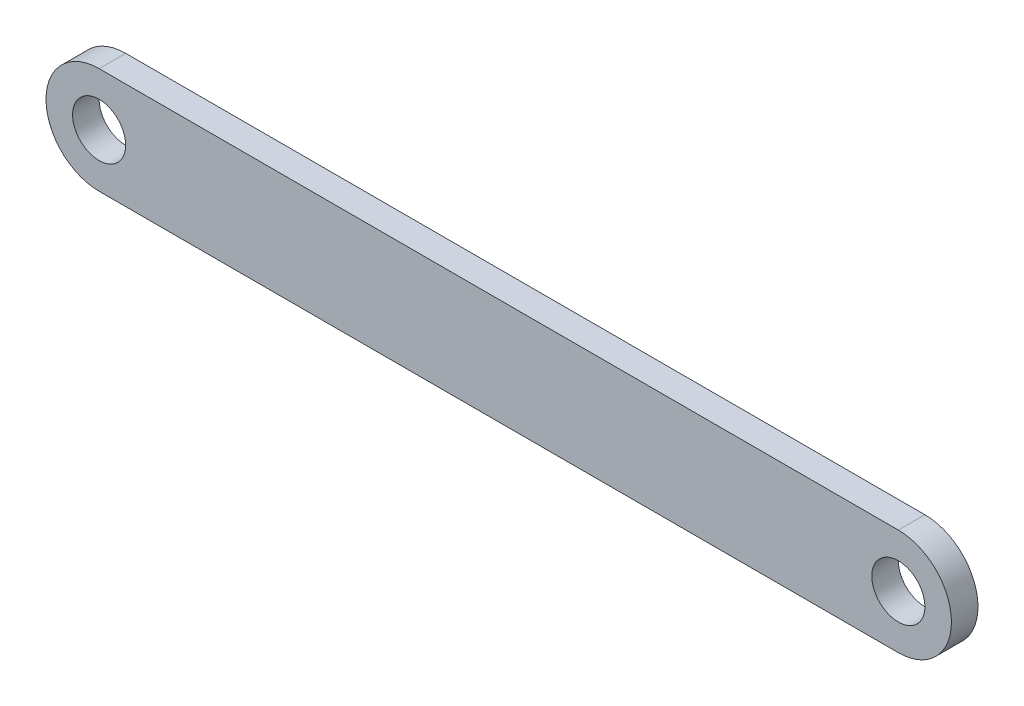
ISO-10303-21;
HEADER;
FILE_DESCRIPTION(('STEP AP214'),'2;1');
FILE_NAME('part.step','',(''),(''),'','','');
FILE_SCHEMA(('AUTOMOTIVE_DESIGN { 1 0 10303 214 1 1 1 1 }'));
ENDSEC;
DATA;
#1=APPLICATION_CONTEXT('core data for automotive mechanical design processes');
#2=APPLICATION_PROTOCOL_DEFINITION('international standard','automotive_design',2000,#1);
#3=PRODUCT_CONTEXT('',#1,'mechanical');
#4=PRODUCT('Part','Part','',(#3));
#5=PRODUCT_RELATED_PRODUCT_CATEGORY('part','',(#4));
#6=PRODUCT_DEFINITION_FORMATION('','',#4);
#7=PRODUCT_DEFINITION_CONTEXT('part definition',#1,'design');
#8=PRODUCT_DEFINITION('design','',#6,#7);
#9=PRODUCT_DEFINITION_SHAPE('','',#8);
#10=(LENGTH_UNIT() NAMED_UNIT(*) SI_UNIT(.MILLI.,.METRE.));
#11=(NAMED_UNIT(*) PLANE_ANGLE_UNIT() SI_UNIT($,.RADIAN.));
#12=(NAMED_UNIT(*) SI_UNIT($,.STERADIAN.) SOLID_ANGLE_UNIT());
#13=UNCERTAINTY_MEASURE_WITH_UNIT(LENGTH_MEASURE(1.E-05),#10,'distance_accuracy_value','');
#14=(GEOMETRIC_REPRESENTATION_CONTEXT(3) GLOBAL_UNCERTAINTY_ASSIGNED_CONTEXT((#13)) GLOBAL_UNIT_ASSIGNED_CONTEXT((#10,
#11,#12)) REPRESENTATION_CONTEXT('',''));
#15=CARTESIAN_POINT('',(0.,0.,0.));
#16=DIRECTION('',(0.,0.,1.));
#17=DIRECTION('',(1.,0.,0.));
#18=AXIS2_PLACEMENT_3D('',#15,#16,#17);
#19=CARTESIAN_POINT('',(0.,-25.4000000000001,6.35));
#20=DIRECTION('',(0.,1.,0.));
#21=DIRECTION('',(-1.,0.,0.));
#22=AXIS2_PLACEMENT_3D('',#19,#20,#21);
#23=PLANE('',#22);
#24=DIRECTION('',(1.,0.,0.));
#25=VECTOR('',#24,1.);
#26=CARTESIAN_POINT('',(0.,-25.4000000000001,-6.35));
#27=LINE('',#26,#25);
#28=CARTESIAN_POINT('',(-191.135,-25.4000000000001,-6.35));
#29=VERTEX_POINT('',#28);
#30=CARTESIAN_POINT('',(191.135,-25.4000000000001,-6.35));
#31=VERTEX_POINT('',#30);
#32=EDGE_CURVE('E107',#29,#31,#27,.T.);
#33=ORIENTED_EDGE('',*,*,#32,.T.);
#34=DIRECTION('',(0.,0.,-1.));
#35=VECTOR('',#34,1.);
#36=CARTESIAN_POINT('',(191.135,-25.4000000000001,6.35));
#37=LINE('',#36,#35);
#38=CARTESIAN_POINT('',(191.135,-25.4000000000001,6.35));
#39=VERTEX_POINT('',#38);
#40=EDGE_CURVE('E11',#39,#31,#37,.T.);
#41=ORIENTED_EDGE('',*,*,#40,.F.);
#42=DIRECTION('',(1.,0.,0.));
#43=VECTOR('',#42,1.);
#44=CARTESIAN_POINT('',(0.,-25.4000000000001,6.35));
#45=LINE('',#44,#43);
#46=CARTESIAN_POINT('',(-191.135,-25.4000000000001,6.35));
#47=VERTEX_POINT('',#46);
#48=EDGE_CURVE('E86',#47,#39,#45,.T.);
#49=ORIENTED_EDGE('',*,*,#48,.F.);
#50=DIRECTION('',(0.,0.,-1.));
#51=VECTOR('',#50,1.);
#52=CARTESIAN_POINT('',(-191.135,-25.4000000000001,6.35));
#53=LINE('',#52,#51);
#54=EDGE_CURVE('E103',#47,#29,#53,.T.);
#55=ORIENTED_EDGE('',*,*,#54,.T.);
#56=EDGE_LOOP('',(#33,#41,#49,#55));
#57=FACE_BOUND('',#56,.T.);
#58=ADVANCED_FACE('F37',(#57),#23,.F.);
#59=CARTESIAN_POINT('',(191.135,0.,6.35));
#60=DIRECTION('',(0.,0.,-1.));
#61=DIRECTION('',(-1.,0.,0.));
#62=AXIS2_PLACEMENT_3D('',#59,#60,#61);
#63=CYLINDRICAL_SURFACE('',#62,25.4);
#64=CARTESIAN_POINT('',(191.135,0.,-6.35));
#65=DIRECTION('',(0.,0.,1.));
#66=DIRECTION('',(1.,0.,0.));
#67=AXIS2_PLACEMENT_3D('',#64,#65,#66);
#68=CIRCLE('',#67,25.4);
#69=CARTESIAN_POINT('',(191.135,25.3999999999999,-6.35));
#70=VERTEX_POINT('',#69);
#71=EDGE_CURVE('E91',#31,#70,#68,.T.);
#72=ORIENTED_EDGE('',*,*,#71,.T.);
#73=DIRECTION('',(0.,0.,-1.));
#74=VECTOR('',#73,1.);
#75=CARTESIAN_POINT('',(191.135,25.3999999999999,6.35));
#76=LINE('',#75,#74);
#77=CARTESIAN_POINT('',(191.135,25.3999999999999,6.35));
#78=VERTEX_POINT('',#77);
#79=EDGE_CURVE('E46',#78,#70,#76,.T.);
#80=ORIENTED_EDGE('',*,*,#79,.F.);
#81=CARTESIAN_POINT('',(191.135,0.,6.35));
#82=DIRECTION('',(0.,0.,1.));
#83=DIRECTION('',(1.,0.,0.));
#84=AXIS2_PLACEMENT_3D('',#81,#82,#83);
#85=CIRCLE('',#84,25.4);
#86=EDGE_CURVE('E80',#39,#78,#85,.T.);
#87=ORIENTED_EDGE('',*,*,#86,.F.);
#88=ORIENTED_EDGE('',*,*,#40,.T.);
#89=EDGE_LOOP('',(#72,#80,#87,#88));
#90=FACE_BOUND('',#89,.T.);
#91=ADVANCED_FACE('F90',(#90),#63,.T.);
#92=CARTESIAN_POINT('',(0.,25.3999999999999,6.35));
#93=DIRECTION('',(0.,1.,0.));
#94=DIRECTION('',(-1.,0.,0.));
#95=AXIS2_PLACEMENT_3D('',#92,#93,#94);
#96=PLANE('',#95);
#97=DIRECTION('',(1.,0.,0.));
#98=VECTOR('',#97,1.);
#99=CARTESIAN_POINT('',(0.,25.3999999999999,-6.35));
#100=LINE('',#99,#98);
#101=CARTESIAN_POINT('',(-191.135,25.3999999999999,-6.35));
#102=VERTEX_POINT('',#101);
#103=EDGE_CURVE('E111',#102,#70,#100,.T.);
#104=ORIENTED_EDGE('',*,*,#103,.F.);
#105=DIRECTION('',(0.,0.,-1.));
#106=VECTOR('',#105,1.);
#107=CARTESIAN_POINT('',(-191.135,25.3999999999999,6.35));
#108=LINE('',#107,#106);
#109=CARTESIAN_POINT('',(-191.135,25.3999999999999,6.35));
#110=VERTEX_POINT('',#109);
#111=EDGE_CURVE('E70',#110,#102,#108,.T.);
#112=ORIENTED_EDGE('',*,*,#111,.F.);
#113=DIRECTION('',(1.,0.,0.));
#114=VECTOR('',#113,1.);
#115=CARTESIAN_POINT('',(0.,25.3999999999999,6.35));
#116=LINE('',#115,#114);
#117=EDGE_CURVE('E84',#110,#78,#116,.T.);
#118=ORIENTED_EDGE('',*,*,#117,.T.);
#119=ORIENTED_EDGE('',*,*,#79,.T.);
#120=EDGE_LOOP('',(#104,#112,#118,#119));
#121=FACE_BOUND('',#120,.T.);
#122=ADVANCED_FACE('F95',(#121),#96,.T.);
#123=CARTESIAN_POINT('',(-191.135,-1.13894724078982E-13,6.35));
#124=DIRECTION('',(0.,0.,-1.));
#125=DIRECTION('',(-1.,0.,0.));
#126=AXIS2_PLACEMENT_3D('',#123,#124,#125);
#127=CYLINDRICAL_SURFACE('',#126,25.4);
#128=CARTESIAN_POINT('',(-191.135,-1.13894724078982E-13,-6.35));
#129=DIRECTION('',(0.,0.,1.));
#130=DIRECTION('',(1.,0.,0.));
#131=AXIS2_PLACEMENT_3D('',#128,#129,#130);
#132=CIRCLE('',#131,25.4);
#133=EDGE_CURVE('E73',#102,#29,#132,.T.);
#134=ORIENTED_EDGE('',*,*,#133,.T.);
#135=ORIENTED_EDGE('',*,*,#54,.F.);
#136=CARTESIAN_POINT('',(-191.135,-1.13894724078982E-13,6.35));
#137=DIRECTION('',(0.,0.,1.));
#138=DIRECTION('',(1.,0.,0.));
#139=AXIS2_PLACEMENT_3D('',#136,#137,#138);
#140=CIRCLE('',#139,25.4);
#141=EDGE_CURVE('E54',#110,#47,#140,.T.);
#142=ORIENTED_EDGE('',*,*,#141,.F.);
#143=ORIENTED_EDGE('',*,*,#111,.T.);
#144=EDGE_LOOP('',(#134,#135,#142,#143));
#145=FACE_BOUND('',#144,.T.);
#146=ADVANCED_FACE('F139',(#145),#127,.T.);
#147=CARTESIAN_POINT('',(-191.135,-1.13894724078982E-13,6.35));
#148=DIRECTION('',(0.,0.,-1.));
#149=DIRECTION('',(-1.,0.,0.));
#150=AXIS2_PLACEMENT_3D('',#147,#148,#149);
#151=CYLINDRICAL_SURFACE('',#150,12.7);
#152=CARTESIAN_POINT('',(-191.135,-1.13894724078982E-13,6.35));
#153=DIRECTION('',(0.,0.,1.));
#154=DIRECTION('',(1.,0.,0.));
#155=AXIS2_PLACEMENT_3D('',#152,#153,#154);
#156=CIRCLE('',#155,12.7);
#157=CARTESIAN_POINT('',(-178.435,-1.13894724078982E-13,6.35));
#158=VERTEX_POINT('',#157);
#159=EDGE_CURVE('E117',#158,#158,#156,.T.);
#160=ORIENTED_EDGE('',*,*,#159,.T.);
#161=EDGE_LOOP('',(#160));
#162=FACE_BOUND('',#161,.T.);
#163=CARTESIAN_POINT('',(-191.135,-1.13894724078982E-13,-6.35));
#164=DIRECTION('',(0.,0.,1.));
#165=DIRECTION('',(1.,0.,0.));
#166=AXIS2_PLACEMENT_3D('',#163,#164,#165);
#167=CIRCLE('',#166,12.7);
#168=CARTESIAN_POINT('',(-178.435,-1.13894724078982E-13,-6.35));
#169=VERTEX_POINT('',#168);
#170=EDGE_CURVE('E104',#169,#169,#167,.T.);
#171=ORIENTED_EDGE('',*,*,#170,.F.);
#172=EDGE_LOOP('',(#171));
#173=FACE_BOUND('',#172,.T.);
#174=ADVANCED_FACE('F39',(#162,#173),#151,.F.);
#175=CARTESIAN_POINT('',(191.135,-1.13894724078982E-13,6.35));
#176=DIRECTION('',(0.,0.,-1.));
#177=DIRECTION('',(-1.,0.,0.));
#178=AXIS2_PLACEMENT_3D('',#175,#176,#177);
#179=CYLINDRICAL_SURFACE('',#178,12.7);
#180=CARTESIAN_POINT('',(191.135,-1.13894724078982E-13,6.35));
#181=DIRECTION('',(0.,0.,1.));
#182=DIRECTION('',(1.,0.,0.));
#183=AXIS2_PLACEMENT_3D('',#180,#181,#182);
#184=CIRCLE('',#183,12.7);
#185=CARTESIAN_POINT('',(203.835,-1.13894724078982E-13,6.35));
#186=VERTEX_POINT('',#185);
#187=EDGE_CURVE('E97',#186,#186,#184,.F.);
#188=ORIENTED_EDGE('',*,*,#187,.F.);
#189=EDGE_LOOP('',(#188));
#190=FACE_BOUND('',#189,.T.);
#191=CARTESIAN_POINT('',(191.135,-1.13894724078982E-13,-6.35));
#192=DIRECTION('',(0.,0.,1.));
#193=DIRECTION('',(1.,0.,0.));
#194=AXIS2_PLACEMENT_3D('',#191,#192,#193);
#195=CIRCLE('',#194,12.7);
#196=CARTESIAN_POINT('',(203.835,-1.13894724078982E-13,-6.35));
#197=VERTEX_POINT('',#196);
#198=EDGE_CURVE('E114',#197,#197,#195,.F.);
#199=ORIENTED_EDGE('',*,*,#198,.T.);
#200=EDGE_LOOP('',(#199));
#201=FACE_BOUND('',#200,.T.);
#202=ADVANCED_FACE('F129',(#190,#201),#179,.F.);
#203=CARTESIAN_POINT('',(0.,0.,6.35));
#204=DIRECTION('',(0.,0.,1.));
#205=DIRECTION('',(1.,0.,0.));
#206=AXIS2_PLACEMENT_3D('',#203,#204,#205);
#207=PLANE('',#206);
#208=ORIENTED_EDGE('',*,*,#159,.F.);
#209=EDGE_LOOP('',(#208));
#210=FACE_BOUND('',#209,.T.);
#211=ORIENTED_EDGE('',*,*,#48,.T.);
#212=ORIENTED_EDGE('',*,*,#86,.T.);
#213=ORIENTED_EDGE('',*,*,#117,.F.);
#214=ORIENTED_EDGE('',*,*,#141,.T.);
#215=EDGE_LOOP('',(#211,#212,#213,#214));
#216=FACE_BOUND('',#215,.T.);
#217=ORIENTED_EDGE('',*,*,#187,.T.);
#218=EDGE_LOOP('',(#217));
#219=FACE_BOUND('',#218,.T.);
#220=ADVANCED_FACE('F81',(#210,#216,#219),#207,.T.);
#221=CARTESIAN_POINT('',(0.,0.,-6.35));
#222=DIRECTION('',(0.,0.,1.));
#223=DIRECTION('',(1.,0.,0.));
#224=AXIS2_PLACEMENT_3D('',#221,#222,#223);
#225=PLANE('',#224);
#226=ORIENTED_EDGE('',*,*,#170,.T.);
#227=EDGE_LOOP('',(#226));
#228=FACE_BOUND('',#227,.T.);
#229=ORIENTED_EDGE('',*,*,#32,.F.);
#230=ORIENTED_EDGE('',*,*,#133,.F.);
#231=ORIENTED_EDGE('',*,*,#103,.T.);
#232=ORIENTED_EDGE('',*,*,#71,.F.);
#233=EDGE_LOOP('',(#229,#230,#231,#232));
#234=FACE_BOUND('',#233,.T.);
#235=ORIENTED_EDGE('',*,*,#198,.F.);
#236=EDGE_LOOP('',(#235));
#237=FACE_BOUND('',#236,.T.);
#238=ADVANCED_FACE('F122',(#228,#234,#237),#225,.F.);
#239=CLOSED_SHELL('',(#58,#91,#122,#146,#174,#202,#220,#238));
#240=MANIFOLD_SOLID_BREP('B2',#239);
#241=ADVANCED_BREP_SHAPE_REPRESENTATION('',(#18,#240),#14);
#242=SHAPE_DEFINITION_REPRESENTATION(#9,#241);
ENDSEC;
END-ISO-10303-21;
